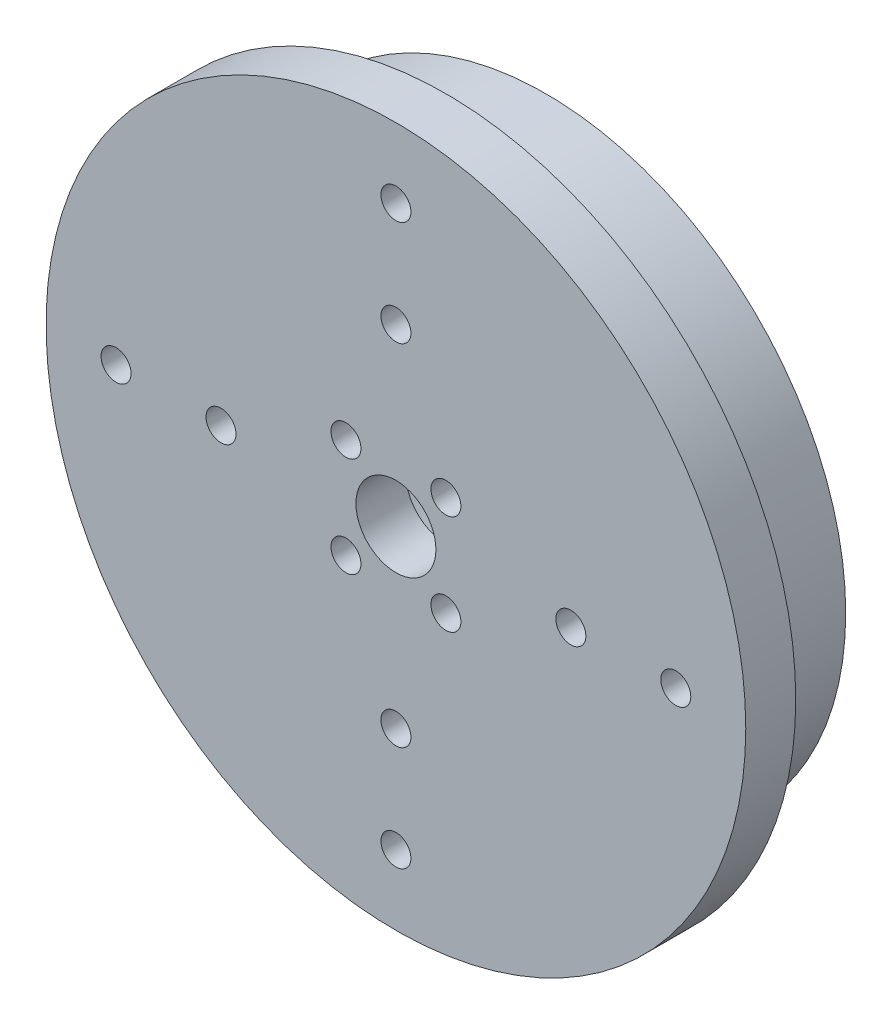
ISO-10303-21;
HEADER;
FILE_DESCRIPTION(('STEP AP214'),'2;1');
FILE_NAME('part.step','',(''),(''),'','','');
FILE_SCHEMA(('AUTOMOTIVE_DESIGN { 1 0 10303 214 1 1 1 1 }'));
ENDSEC;
DATA;
#1=APPLICATION_CONTEXT('core data for automotive mechanical design processes');
#2=APPLICATION_PROTOCOL_DEFINITION('international standard','automotive_design',2000,#1);
#3=PRODUCT_CONTEXT('',#1,'mechanical');
#4=PRODUCT('Part','Part','',(#3));
#5=PRODUCT_RELATED_PRODUCT_CATEGORY('part','',(#4));
#6=PRODUCT_DEFINITION_FORMATION('','',#4);
#7=PRODUCT_DEFINITION_CONTEXT('part definition',#1,'design');
#8=PRODUCT_DEFINITION('design','',#6,#7);
#9=PRODUCT_DEFINITION_SHAPE('','',#8);
#10=(LENGTH_UNIT() NAMED_UNIT(*) SI_UNIT(.MILLI.,.METRE.));
#11=(NAMED_UNIT(*) PLANE_ANGLE_UNIT() SI_UNIT($,.RADIAN.));
#12=(NAMED_UNIT(*) SI_UNIT($,.STERADIAN.) SOLID_ANGLE_UNIT());
#13=UNCERTAINTY_MEASURE_WITH_UNIT(LENGTH_MEASURE(1.E-05),#10,'distance_accuracy_value','');
#14=(GEOMETRIC_REPRESENTATION_CONTEXT(3) GLOBAL_UNCERTAINTY_ASSIGNED_CONTEXT((#13)) GLOBAL_UNIT_ASSIGNED_CONTEXT((#10,
#11,#12)) REPRESENTATION_CONTEXT('',''));
#15=CARTESIAN_POINT('',(0.,0.,0.));
#16=DIRECTION('',(0.,0.,1.));
#17=DIRECTION('',(1.,0.,0.));
#18=AXIS2_PLACEMENT_3D('',#15,#16,#17);
#19=CARTESIAN_POINT('',(0.,0.,0.));
#20=DIRECTION('',(0.,0.,1.));
#21=DIRECTION('',(1.,0.,0.));
#22=AXIS2_PLACEMENT_3D('',#19,#20,#21);
#23=PLANE('',#22);
#24=CARTESIAN_POINT('',(-4.99999999999998,-5.00000000000002,0.));
#25=DIRECTION('',(0.,0.,-1.));
#26=DIRECTION('',(-1.,0.,0.));
#27=AXIS2_PLACEMENT_3D('',#24,#25,#26);
#28=CIRCLE('',#27,1.5);
#29=CARTESIAN_POINT('',(-6.49999999999998,-5.00000000000002,0.));
#30=VERTEX_POINT('',#29);
#31=EDGE_CURVE('E231',#30,#30,#28,.T.);
#32=ORIENTED_EDGE('',*,*,#31,.F.);
#33=EDGE_LOOP('',(#32));
#34=FACE_BOUND('',#33,.T.);
#35=CARTESIAN_POINT('',(5.00000000000003,-4.99999999999997,0.));
#36=DIRECTION('',(0.,0.,-1.));
#37=DIRECTION('',(-1.,0.,0.));
#38=AXIS2_PLACEMENT_3D('',#35,#36,#37);
#39=CIRCLE('',#38,1.5);
#40=CARTESIAN_POINT('',(3.50000000000003,-4.99999999999997,0.));
#41=VERTEX_POINT('',#40);
#42=EDGE_CURVE('E232',#41,#41,#39,.T.);
#43=ORIENTED_EDGE('',*,*,#42,.F.);
#44=EDGE_LOOP('',(#43));
#45=FACE_BOUND('',#44,.T.);
#46=CARTESIAN_POINT('',(4.99999999999995,5.00000000000005,0.));
#47=DIRECTION('',(0.,0.,-1.));
#48=DIRECTION('',(-1.,0.,0.));
#49=AXIS2_PLACEMENT_3D('',#46,#47,#48);
#50=CIRCLE('',#49,1.5);
#51=CARTESIAN_POINT('',(3.49999999999995,5.00000000000005,0.));
#52=VERTEX_POINT('',#51);
#53=EDGE_CURVE('E243',#52,#52,#50,.T.);
#54=ORIENTED_EDGE('',*,*,#53,.F.);
#55=EDGE_LOOP('',(#54));
#56=FACE_BOUND('',#55,.T.);
#57=CARTESIAN_POINT('',(-5.,5.,0.));
#58=DIRECTION('',(0.,0.,-1.));
#59=DIRECTION('',(-1.,0.,0.));
#60=AXIS2_PLACEMENT_3D('',#57,#58,#59);
#61=CIRCLE('',#60,1.5);
#62=CARTESIAN_POINT('',(-6.5,5.,0.));
#63=VERTEX_POINT('',#62);
#64=EDGE_CURVE('E227',#63,#63,#61,.T.);
#65=ORIENTED_EDGE('',*,*,#64,.F.);
#66=EDGE_LOOP('',(#65));
#67=FACE_BOUND('',#66,.T.);
#68=CARTESIAN_POINT('',(0.,0.,0.));
#69=DIRECTION('',(0.,0.,-1.));
#70=DIRECTION('',(-1.,0.,0.));
#71=AXIS2_PLACEMENT_3D('',#68,#69,#70);
#72=CIRCLE('',#71,15.);
#73=CARTESIAN_POINT('',(-15.,0.,0.));
#74=VERTEX_POINT('',#73);
#75=EDGE_CURVE('E184',#74,#74,#72,.T.);
#76=ORIENTED_EDGE('',*,*,#75,.T.);
#77=EDGE_LOOP('',(#76));
#78=FACE_BOUND('',#77,.T.);
#79=CARTESIAN_POINT('',(0.,0.,0.));
#80=DIRECTION('',(0.,0.,-1.));
#81=DIRECTION('',(-1.,0.,0.));
#82=AXIS2_PLACEMENT_3D('',#79,#80,#81);
#83=CIRCLE('',#82,4.);
#84=CARTESIAN_POINT('',(-4.,0.,0.));
#85=VERTEX_POINT('',#84);
#86=EDGE_CURVE('E236',#85,#85,#83,.T.);
#87=ORIENTED_EDGE('',*,*,#86,.F.);
#88=EDGE_LOOP('',(#87));
#89=FACE_BOUND('',#88,.T.);
#90=ADVANCED_FACE('F99',(#34,#45,#56,#67,#78,#89),#23,.F.);
#91=CARTESIAN_POINT('',(0.,0.,0.));
#92=DIRECTION('',(0.,0.,1.));
#93=DIRECTION('',(1.,0.,0.));
#94=AXIS2_PLACEMENT_3D('',#91,#92,#93);
#95=CIRCLE('',#94,20.);
#96=CARTESIAN_POINT('',(20.,0.,0.));
#97=VERTEX_POINT('',#96);
#98=EDGE_CURVE('E11',#97,#97,#95,.F.);
#99=ORIENTED_EDGE('',*,*,#98,.F.);
#100=EDGE_LOOP('',(#99));
#101=FACE_BOUND('',#100,.T.);
#102=CARTESIAN_POINT('',(0.,0.,0.));
#103=DIRECTION('',(0.,0.,-1.));
#104=DIRECTION('',(-1.,0.,0.));
#105=AXIS2_PLACEMENT_3D('',#102,#103,#104);
#106=CIRCLE('',#105,26.);
#107=CARTESIAN_POINT('',(-26.,0.,0.));
#108=VERTEX_POINT('',#107);
#109=EDGE_CURVE('E156',#108,#108,#106,.T.);
#110=ORIENTED_EDGE('',*,*,#109,.T.);
#111=EDGE_LOOP('',(#110));
#112=FACE_BOUND('',#111,.T.);
#113=ADVANCED_FACE('F252',(#101,#112),#23,.F.);
#114=CARTESIAN_POINT('',(17.5,0.,5.));
#115=DIRECTION('',(0.,0.,-1.));
#116=DIRECTION('',(-1.,0.,0.));
#117=AXIS2_PLACEMENT_3D('',#114,#115,#116);
#118=CYLINDRICAL_SURFACE('',#117,1.5);
#119=CARTESIAN_POINT('',(17.5,0.,5.));
#120=DIRECTION('',(0.,0.,1.));
#121=DIRECTION('',(1.,0.,0.));
#122=AXIS2_PLACEMENT_3D('',#119,#120,#121);
#123=CIRCLE('',#122,1.5);
#124=CARTESIAN_POINT('',(19.,0.,5.));
#125=VERTEX_POINT('',#124);
#126=EDGE_CURVE('E125',#125,#125,#123,.T.);
#127=ORIENTED_EDGE('',*,*,#126,.T.);
#128=EDGE_LOOP('',(#127));
#129=FACE_BOUND('',#128,.T.);
#130=CARTESIAN_POINT('',(17.5,0.,-10.));
#131=DIRECTION('',(0.,0.,-1.));
#132=DIRECTION('',(-1.,0.,0.));
#133=AXIS2_PLACEMENT_3D('',#130,#131,#132);
#134=CIRCLE('',#133,1.5);
#135=CARTESIAN_POINT('',(16.,0.,-10.));
#136=VERTEX_POINT('',#135);
#137=EDGE_CURVE('E204',#136,#136,#134,.F.);
#138=ORIENTED_EDGE('',*,*,#137,.F.);
#139=EDGE_LOOP('',(#138));
#140=FACE_BOUND('',#139,.T.);
#141=ADVANCED_FACE('F317',(#129,#140),#118,.F.);
#142=CARTESIAN_POINT('',(-1.2220184685951E-13,-17.5,5.));
#143=DIRECTION('',(0.,0.,-1.));
#144=DIRECTION('',(-1.,0.,0.));
#145=AXIS2_PLACEMENT_3D('',#142,#143,#144);
#146=CYLINDRICAL_SURFACE('',#145,1.5);
#147=CARTESIAN_POINT('',(-1.2220184685951E-13,-17.5,5.));
#148=DIRECTION('',(0.,0.,1.));
#149=DIRECTION('',(1.,0.,0.));
#150=AXIS2_PLACEMENT_3D('',#147,#148,#149);
#151=CIRCLE('',#150,1.5);
#152=CARTESIAN_POINT('',(1.49999999999988,-17.5,5.));
#153=VERTEX_POINT('',#152);
#154=EDGE_CURVE('E129',#153,#153,#151,.T.);
#155=ORIENTED_EDGE('',*,*,#154,.T.);
#156=EDGE_LOOP('',(#155));
#157=FACE_BOUND('',#156,.T.);
#158=CARTESIAN_POINT('',(-1.2220184685951E-13,-17.5,-10.));
#159=DIRECTION('',(0.,0.,-1.));
#160=DIRECTION('',(-1.,0.,0.));
#161=AXIS2_PLACEMENT_3D('',#158,#159,#160);
#162=CIRCLE('',#161,1.5);
#163=CARTESIAN_POINT('',(-1.50000000000012,-17.5,-10.));
#164=VERTEX_POINT('',#163);
#165=EDGE_CURVE('E196',#164,#164,#162,.F.);
#166=ORIENTED_EDGE('',*,*,#165,.F.);
#167=EDGE_LOOP('',(#166));
#168=FACE_BOUND('',#167,.T.);
#169=ADVANCED_FACE('F320',(#157,#168),#146,.F.);
#170=CARTESIAN_POINT('',(-17.5,1.83302770289265E-13,5.));
#171=DIRECTION('',(0.,0.,-1.));
#172=DIRECTION('',(-1.,0.,0.));
#173=AXIS2_PLACEMENT_3D('',#170,#171,#172);
#174=CYLINDRICAL_SURFACE('',#173,1.5);
#175=CARTESIAN_POINT('',(-17.5,1.83302770289265E-13,5.));
#176=DIRECTION('',(0.,0.,1.));
#177=DIRECTION('',(1.,0.,0.));
#178=AXIS2_PLACEMENT_3D('',#175,#176,#177);
#179=CIRCLE('',#178,1.5);
#180=CARTESIAN_POINT('',(-16.,1.83302770289265E-13,5.));
#181=VERTEX_POINT('',#180);
#182=EDGE_CURVE('E133',#181,#181,#179,.T.);
#183=ORIENTED_EDGE('',*,*,#182,.T.);
#184=EDGE_LOOP('',(#183));
#185=FACE_BOUND('',#184,.T.);
#186=CARTESIAN_POINT('',(-17.5,1.83302770289265E-13,-10.));
#187=DIRECTION('',(0.,0.,-1.));
#188=DIRECTION('',(-1.,0.,0.));
#189=AXIS2_PLACEMENT_3D('',#186,#187,#188);
#190=CIRCLE('',#189,1.5);
#191=CARTESIAN_POINT('',(-19.,1.83302770289265E-13,-10.));
#192=VERTEX_POINT('',#191);
#193=EDGE_CURVE('E188',#192,#192,#190,.F.);
#194=ORIENTED_EDGE('',*,*,#193,.F.);
#195=EDGE_LOOP('',(#194));
#196=FACE_BOUND('',#195,.T.);
#197=ADVANCED_FACE('F324',(#185,#196),#174,.F.);
#198=CARTESIAN_POINT('',(0.,28.,5.));
#199=DIRECTION('',(0.,0.,-1.));
#200=DIRECTION('',(-1.,0.,0.));
#201=AXIS2_PLACEMENT_3D('',#198,#199,#200);
#202=CYLINDRICAL_SURFACE('',#201,1.5);
#203=CARTESIAN_POINT('',(0.,28.,5.));
#204=DIRECTION('',(0.,0.,1.));
#205=DIRECTION('',(1.,0.,0.));
#206=AXIS2_PLACEMENT_3D('',#203,#204,#205);
#207=CIRCLE('',#206,1.5);
#208=CARTESIAN_POINT('',(1.5,28.,5.));
#209=VERTEX_POINT('',#208);
#210=EDGE_CURVE('E137',#209,#209,#207,.T.);
#211=ORIENTED_EDGE('',*,*,#210,.T.);
#212=EDGE_LOOP('',(#211));
#213=FACE_BOUND('',#212,.T.);
#214=CARTESIAN_POINT('',(0.,28.,-10.));
#215=DIRECTION('',(0.,0.,-1.));
#216=DIRECTION('',(-1.,0.,0.));
#217=AXIS2_PLACEMENT_3D('',#214,#215,#216);
#218=CIRCLE('',#217,1.5);
#219=CARTESIAN_POINT('',(-1.5,28.,-10.));
#220=VERTEX_POINT('',#219);
#221=EDGE_CURVE('E177',#220,#220,#218,.F.);
#222=ORIENTED_EDGE('',*,*,#221,.F.);
#223=EDGE_LOOP('',(#222));
#224=FACE_BOUND('',#223,.T.);
#225=ADVANCED_FACE('F328',(#213,#224),#202,.F.);
#226=CARTESIAN_POINT('',(28.,0.,5.));
#227=DIRECTION('',(0.,0.,-1.));
#228=DIRECTION('',(-1.,0.,0.));
#229=AXIS2_PLACEMENT_3D('',#226,#227,#228);
#230=CYLINDRICAL_SURFACE('',#229,1.5);
#231=CARTESIAN_POINT('',(28.,0.,5.));
#232=DIRECTION('',(0.,0.,1.));
#233=DIRECTION('',(1.,0.,0.));
#234=AXIS2_PLACEMENT_3D('',#231,#232,#233);
#235=CIRCLE('',#234,1.5);
#236=CARTESIAN_POINT('',(29.5,0.,5.));
#237=VERTEX_POINT('',#236);
#238=EDGE_CURVE('E141',#237,#237,#235,.T.);
#239=ORIENTED_EDGE('',*,*,#238,.T.);
#240=EDGE_LOOP('',(#239));
#241=FACE_BOUND('',#240,.T.);
#242=CARTESIAN_POINT('',(28.,0.,-10.));
#243=DIRECTION('',(0.,0.,-1.));
#244=DIRECTION('',(-1.,0.,0.));
#245=AXIS2_PLACEMENT_3D('',#242,#243,#244);
#246=CIRCLE('',#245,1.5);
#247=CARTESIAN_POINT('',(26.5,0.,-10.));
#248=VERTEX_POINT('',#247);
#249=EDGE_CURVE('E173',#248,#248,#246,.F.);
#250=ORIENTED_EDGE('',*,*,#249,.F.);
#251=EDGE_LOOP('',(#250));
#252=FACE_BOUND('',#251,.T.);
#253=ADVANCED_FACE('F332',(#241,#252),#230,.F.);
#254=CARTESIAN_POINT('',(-1.95522954975215E-13,-28.,5.));
#255=DIRECTION('',(0.,0.,-1.));
#256=DIRECTION('',(-1.,0.,0.));
#257=AXIS2_PLACEMENT_3D('',#254,#255,#256);
#258=CYLINDRICAL_SURFACE('',#257,1.5);
#259=CARTESIAN_POINT('',(-1.95522954975215E-13,-28.,5.));
#260=DIRECTION('',(0.,0.,1.));
#261=DIRECTION('',(1.,0.,0.));
#262=AXIS2_PLACEMENT_3D('',#259,#260,#261);
#263=CIRCLE('',#262,1.5);
#264=CARTESIAN_POINT('',(1.4999999999998,-28.,5.));
#265=VERTEX_POINT('',#264);
#266=EDGE_CURVE('E145',#265,#265,#263,.T.);
#267=ORIENTED_EDGE('',*,*,#266,.T.);
#268=EDGE_LOOP('',(#267));
#269=FACE_BOUND('',#268,.T.);
#270=CARTESIAN_POINT('',(-1.95522954975215E-13,-28.,-10.));
#271=DIRECTION('',(0.,0.,-1.));
#272=DIRECTION('',(-1.,0.,0.));
#273=AXIS2_PLACEMENT_3D('',#270,#271,#272);
#274=CIRCLE('',#273,1.5);
#275=CARTESIAN_POINT('',(-1.5000000000002,-28.,-10.));
#276=VERTEX_POINT('',#275);
#277=EDGE_CURVE('E160',#276,#276,#274,.F.);
#278=ORIENTED_EDGE('',*,*,#277,.F.);
#279=EDGE_LOOP('',(#278));
#280=FACE_BOUND('',#279,.T.);
#281=ADVANCED_FACE('F336',(#269,#280),#258,.F.);
#282=CARTESIAN_POINT('',(-28.,2.93284432462823E-13,5.));
#283=DIRECTION('',(0.,0.,-1.));
#284=DIRECTION('',(-1.,0.,0.));
#285=AXIS2_PLACEMENT_3D('',#282,#283,#284);
#286=CYLINDRICAL_SURFACE('',#285,1.5);
#287=CARTESIAN_POINT('',(-28.,2.93284432462823E-13,5.));
#288=DIRECTION('',(0.,0.,1.));
#289=DIRECTION('',(1.,0.,0.));
#290=AXIS2_PLACEMENT_3D('',#287,#288,#289);
#291=CIRCLE('',#290,1.5);
#292=CARTESIAN_POINT('',(-26.5,2.93284432462823E-13,5.));
#293=VERTEX_POINT('',#292);
#294=EDGE_CURVE('E149',#293,#293,#291,.T.);
#295=ORIENTED_EDGE('',*,*,#294,.T.);
#296=EDGE_LOOP('',(#295));
#297=FACE_BOUND('',#296,.T.);
#298=CARTESIAN_POINT('',(-28.,2.93284432462823E-13,-10.));
#299=DIRECTION('',(0.,0.,-1.));
#300=DIRECTION('',(-1.,0.,0.));
#301=AXIS2_PLACEMENT_3D('',#298,#299,#300);
#302=CIRCLE('',#301,1.5);
#303=CARTESIAN_POINT('',(-29.5,2.93284432462823E-13,-10.));
#304=VERTEX_POINT('',#303);
#305=EDGE_CURVE('E169',#304,#304,#302,.F.);
#306=ORIENTED_EDGE('',*,*,#305,.F.);
#307=EDGE_LOOP('',(#306));
#308=FACE_BOUND('',#307,.T.);
#309=ADVANCED_FACE('F339',(#297,#308),#286,.F.);
#310=CARTESIAN_POINT('',(0.,0.,5.));
#311=DIRECTION('',(0.,0.,-1.));
#312=DIRECTION('',(-1.,0.,0.));
#313=AXIS2_PLACEMENT_3D('',#310,#311,#312);
#314=CYLINDRICAL_SURFACE('',#313,35.);
#315=CARTESIAN_POINT('',(0.,0.,5.));
#316=DIRECTION('',(0.,0.,1.));
#317=DIRECTION('',(1.,0.,0.));
#318=AXIS2_PLACEMENT_3D('',#315,#316,#317);
#319=CIRCLE('',#318,35.);
#320=CARTESIAN_POINT('',(35.,0.,5.));
#321=VERTEX_POINT('',#320);
#322=EDGE_CURVE('E120',#321,#321,#319,.T.);
#323=ORIENTED_EDGE('',*,*,#322,.F.);
#324=EDGE_LOOP('',(#323));
#325=FACE_BOUND('',#324,.T.);
#326=CARTESIAN_POINT('',(0.,0.,0.));
#327=DIRECTION('',(0.,0.,1.));
#328=DIRECTION('',(1.,0.,0.));
#329=AXIS2_PLACEMENT_3D('',#326,#327,#328);
#330=CIRCLE('',#329,35.);
#331=CARTESIAN_POINT('',(35.,0.,0.));
#332=VERTEX_POINT('',#331);
#333=EDGE_CURVE('E116',#332,#332,#330,.T.);
#334=ORIENTED_EDGE('',*,*,#333,.T.);
#335=EDGE_LOOP('',(#334));
#336=FACE_BOUND('',#335,.T.);
#337=ADVANCED_FACE('F101',(#325,#336),#314,.T.);
#338=CARTESIAN_POINT('',(0.,17.5,5.));
#339=DIRECTION('',(0.,0.,-1.));
#340=DIRECTION('',(-1.,0.,0.));
#341=AXIS2_PLACEMENT_3D('',#338,#339,#340);
#342=CYLINDRICAL_SURFACE('',#341,1.5);
#343=CARTESIAN_POINT('',(0.,17.5,5.));
#344=DIRECTION('',(0.,0.,1.));
#345=DIRECTION('',(1.,0.,0.));
#346=AXIS2_PLACEMENT_3D('',#343,#344,#345);
#347=CIRCLE('',#346,1.5);
#348=CARTESIAN_POINT('',(1.5,17.5,5.));
#349=VERTEX_POINT('',#348);
#350=EDGE_CURVE('E113',#349,#349,#347,.T.);
#351=ORIENTED_EDGE('',*,*,#350,.T.);
#352=EDGE_LOOP('',(#351));
#353=FACE_BOUND('',#352,.T.);
#354=CARTESIAN_POINT('',(0.,17.5,-10.));
#355=DIRECTION('',(0.,0.,-1.));
#356=DIRECTION('',(-1.,0.,0.));
#357=AXIS2_PLACEMENT_3D('',#354,#355,#356);
#358=CIRCLE('',#357,1.5);
#359=CARTESIAN_POINT('',(-1.5,17.5,-10.));
#360=VERTEX_POINT('',#359);
#361=EDGE_CURVE('E200',#360,#360,#358,.F.);
#362=ORIENTED_EDGE('',*,*,#361,.F.);
#363=EDGE_LOOP('',(#362));
#364=FACE_BOUND('',#363,.T.);
#365=ADVANCED_FACE('F309',(#353,#364),#342,.F.);
#366=CARTESIAN_POINT('',(0.,0.,5.));
#367=DIRECTION('',(0.,0.,1.));
#368=DIRECTION('',(1.,0.,0.));
#369=AXIS2_PLACEMENT_3D('',#366,#367,#368);
#370=PLANE('',#369);
#371=CARTESIAN_POINT('',(-4.99999999999998,-5.00000000000002,5.));
#372=DIRECTION('',(0.,0.,1.));
#373=DIRECTION('',(1.,0.,0.));
#374=AXIS2_PLACEMENT_3D('',#371,#372,#373);
#375=CIRCLE('',#374,1.5);
#376=CARTESIAN_POINT('',(-3.49999999999998,-5.00000000000002,5.));
#377=VERTEX_POINT('',#376);
#378=EDGE_CURVE('E211',#377,#377,#375,.T.);
#379=ORIENTED_EDGE('',*,*,#378,.F.);
#380=EDGE_LOOP('',(#379));
#381=FACE_BOUND('',#380,.T.);
#382=CARTESIAN_POINT('',(5.00000000000003,-4.99999999999997,5.));
#383=DIRECTION('',(0.,0.,1.));
#384=DIRECTION('',(1.,0.,0.));
#385=AXIS2_PLACEMENT_3D('',#382,#383,#384);
#386=CIRCLE('',#385,1.5);
#387=CARTESIAN_POINT('',(6.50000000000003,-4.99999999999997,5.));
#388=VERTEX_POINT('',#387);
#389=EDGE_CURVE('E215',#388,#388,#386,.T.);
#390=ORIENTED_EDGE('',*,*,#389,.F.);
#391=EDGE_LOOP('',(#390));
#392=FACE_BOUND('',#391,.T.);
#393=CARTESIAN_POINT('',(4.99999999999995,5.00000000000005,5.));
#394=DIRECTION('',(0.,0.,1.));
#395=DIRECTION('',(1.,0.,0.));
#396=AXIS2_PLACEMENT_3D('',#393,#394,#395);
#397=CIRCLE('',#396,1.5);
#398=CARTESIAN_POINT('',(6.49999999999995,5.00000000000005,5.));
#399=VERTEX_POINT('',#398);
#400=EDGE_CURVE('E219',#399,#399,#397,.T.);
#401=ORIENTED_EDGE('',*,*,#400,.F.);
#402=EDGE_LOOP('',(#401));
#403=FACE_BOUND('',#402,.T.);
#404=CARTESIAN_POINT('',(0.,0.,5.));
#405=DIRECTION('',(0.,0.,1.));
#406=DIRECTION('',(1.,0.,0.));
#407=AXIS2_PLACEMENT_3D('',#404,#405,#406);
#408=CIRCLE('',#407,4.);
#409=CARTESIAN_POINT('',(4.,0.,5.));
#410=VERTEX_POINT('',#409);
#411=EDGE_CURVE('E103',#410,#410,#408,.T.);
#412=ORIENTED_EDGE('',*,*,#411,.F.);
#413=EDGE_LOOP('',(#412));
#414=FACE_BOUND('',#413,.T.);
#415=CARTESIAN_POINT('',(-5.,5.,5.));
#416=DIRECTION('',(0.,0.,1.));
#417=DIRECTION('',(1.,0.,0.));
#418=AXIS2_PLACEMENT_3D('',#415,#416,#417);
#419=CIRCLE('',#418,1.5);
#420=CARTESIAN_POINT('',(-3.5,5.,5.));
#421=VERTEX_POINT('',#420);
#422=EDGE_CURVE('E223',#421,#421,#419,.T.);
#423=ORIENTED_EDGE('',*,*,#422,.F.);
#424=EDGE_LOOP('',(#423));
#425=FACE_BOUND('',#424,.T.);
#426=ORIENTED_EDGE('',*,*,#322,.T.);
#427=EDGE_LOOP('',(#426));
#428=FACE_BOUND('',#427,.T.);
#429=ORIENTED_EDGE('',*,*,#294,.F.);
#430=EDGE_LOOP('',(#429));
#431=FACE_BOUND('',#430,.T.);
#432=ORIENTED_EDGE('',*,*,#266,.F.);
#433=EDGE_LOOP('',(#432));
#434=FACE_BOUND('',#433,.T.);
#435=ORIENTED_EDGE('',*,*,#238,.F.);
#436=EDGE_LOOP('',(#435));
#437=FACE_BOUND('',#436,.T.);
#438=ORIENTED_EDGE('',*,*,#210,.F.);
#439=EDGE_LOOP('',(#438));
#440=FACE_BOUND('',#439,.T.);
#441=ORIENTED_EDGE('',*,*,#182,.F.);
#442=EDGE_LOOP('',(#441));
#443=FACE_BOUND('',#442,.T.);
#444=ORIENTED_EDGE('',*,*,#154,.F.);
#445=EDGE_LOOP('',(#444));
#446=FACE_BOUND('',#445,.T.);
#447=ORIENTED_EDGE('',*,*,#126,.F.);
#448=EDGE_LOOP('',(#447));
#449=FACE_BOUND('',#448,.T.);
#450=ORIENTED_EDGE('',*,*,#350,.F.);
#451=EDGE_LOOP('',(#450));
#452=FACE_BOUND('',#451,.T.);
#453=ADVANCED_FACE('F307',(#381,#392,#403,#414,#425,#428,#431,#434,#437,#440,#443,#446,#449,
#452),#370,.T.);
#454=CARTESIAN_POINT('',(0.,0.,0.));
#455=DIRECTION('',(0.,0.,1.));
#456=DIRECTION('',(1.,0.,0.));
#457=AXIS2_PLACEMENT_3D('',#454,#455,#456);
#458=CIRCLE('',#457,30.);
#459=CARTESIAN_POINT('',(30.,0.,0.));
#460=VERTEX_POINT('',#459);
#461=EDGE_CURVE('E108',#460,#460,#458,.F.);
#462=ORIENTED_EDGE('',*,*,#461,.F.);
#463=EDGE_LOOP('',(#462));
#464=FACE_BOUND('',#463,.T.);
#465=ORIENTED_EDGE('',*,*,#333,.F.);
#466=EDGE_LOOP('',(#465));
#467=FACE_BOUND('',#466,.T.);
#468=ADVANCED_FACE('F255',(#464,#467),#23,.F.);
#469=CARTESIAN_POINT('',(0.,0.,-10.));
#470=DIRECTION('',(0.,0.,1.));
#471=DIRECTION('',(1.,0.,0.));
#472=AXIS2_PLACEMENT_3D('',#469,#470,#471);
#473=CYLINDRICAL_SURFACE('',#472,26.);
#474=CARTESIAN_POINT('',(0.,0.,-10.));
#475=DIRECTION('',(0.,0.,-1.));
#476=DIRECTION('',(-1.,0.,0.));
#477=AXIS2_PLACEMENT_3D('',#474,#475,#476);
#478=CIRCLE('',#477,26.);
#479=CARTESIAN_POINT('',(-26.,0.,-10.));
#480=VERTEX_POINT('',#479);
#481=EDGE_CURVE('E165',#480,#480,#478,.T.);
#482=ORIENTED_EDGE('',*,*,#481,.T.);
#483=EDGE_LOOP('',(#482));
#484=FACE_BOUND('',#483,.T.);
#485=ORIENTED_EDGE('',*,*,#109,.F.);
#486=EDGE_LOOP('',(#485));
#487=FACE_BOUND('',#486,.T.);
#488=ADVANCED_FACE('F302',(#484,#487),#473,.F.);
#489=CARTESIAN_POINT('',(0.,0.,-10.));
#490=DIRECTION('',(0.,0.,1.));
#491=DIRECTION('',(1.,0.,0.));
#492=AXIS2_PLACEMENT_3D('',#489,#490,#491);
#493=CYLINDRICAL_SURFACE('',#492,30.);
#494=CARTESIAN_POINT('',(0.,0.,-10.));
#495=DIRECTION('',(0.,0.,-1.));
#496=DIRECTION('',(-1.,0.,0.));
#497=AXIS2_PLACEMENT_3D('',#494,#495,#496);
#498=CIRCLE('',#497,30.);
#499=CARTESIAN_POINT('',(-30.,0.,-10.));
#500=VERTEX_POINT('',#499);
#501=EDGE_CURVE('E121',#500,#500,#498,.T.);
#502=ORIENTED_EDGE('',*,*,#501,.F.);
#503=EDGE_LOOP('',(#502));
#504=FACE_BOUND('',#503,.T.);
#505=ORIENTED_EDGE('',*,*,#461,.T.);
#506=EDGE_LOOP('',(#505));
#507=FACE_BOUND('',#506,.T.);
#508=ADVANCED_FACE('F298',(#504,#507),#493,.T.);
#509=CARTESIAN_POINT('',(0.,0.,-10.));
#510=DIRECTION('',(0.,0.,-1.));
#511=DIRECTION('',(-1.,0.,0.));
#512=AXIS2_PLACEMENT_3D('',#509,#510,#511);
#513=PLANE('',#512);
#514=ORIENTED_EDGE('',*,*,#277,.T.);
#515=EDGE_LOOP('',(#514));
#516=FACE_BOUND('',#515,.T.);
#517=ORIENTED_EDGE('',*,*,#221,.T.);
#518=EDGE_LOOP('',(#517));
#519=FACE_BOUND('',#518,.T.);
#520=ORIENTED_EDGE('',*,*,#249,.T.);
#521=EDGE_LOOP('',(#520));
#522=FACE_BOUND('',#521,.T.);
#523=ORIENTED_EDGE('',*,*,#305,.T.);
#524=EDGE_LOOP('',(#523));
#525=FACE_BOUND('',#524,.T.);
#526=ORIENTED_EDGE('',*,*,#481,.F.);
#527=EDGE_LOOP('',(#526));
#528=FACE_BOUND('',#527,.T.);
#529=ORIENTED_EDGE('',*,*,#501,.T.);
#530=EDGE_LOOP('',(#529));
#531=FACE_BOUND('',#530,.T.);
#532=ADVANCED_FACE('F294',(#516,#519,#522,#525,#528,#531),#513,.T.);
#533=CARTESIAN_POINT('',(0.,0.,-10.));
#534=DIRECTION('',(0.,0.,1.));
#535=DIRECTION('',(1.,0.,0.));
#536=AXIS2_PLACEMENT_3D('',#533,#534,#535);
#537=CYLINDRICAL_SURFACE('',#536,15.);
#538=CARTESIAN_POINT('',(0.,0.,-10.));
#539=DIRECTION('',(0.,0.,-1.));
#540=DIRECTION('',(-1.,0.,0.));
#541=AXIS2_PLACEMENT_3D('',#538,#539,#540);
#542=CIRCLE('',#541,15.);
#543=CARTESIAN_POINT('',(-15.,0.,-10.));
#544=VERTEX_POINT('',#543);
#545=EDGE_CURVE('E192',#544,#544,#542,.T.);
#546=ORIENTED_EDGE('',*,*,#545,.T.);
#547=EDGE_LOOP('',(#546));
#548=FACE_BOUND('',#547,.T.);
#549=ORIENTED_EDGE('',*,*,#75,.F.);
#550=EDGE_LOOP('',(#549));
#551=FACE_BOUND('',#550,.T.);
#552=ADVANCED_FACE('F290',(#548,#551),#537,.F.);
#553=CARTESIAN_POINT('',(0.,0.,-10.));
#554=DIRECTION('',(0.,0.,1.));
#555=DIRECTION('',(1.,0.,0.));
#556=AXIS2_PLACEMENT_3D('',#553,#554,#555);
#557=CYLINDRICAL_SURFACE('',#556,20.);
#558=CARTESIAN_POINT('',(0.,0.,-10.));
#559=DIRECTION('',(0.,0.,-1.));
#560=DIRECTION('',(-1.,0.,0.));
#561=AXIS2_PLACEMENT_3D('',#558,#559,#560);
#562=CIRCLE('',#561,20.);
#563=CARTESIAN_POINT('',(-20.,0.,-10.));
#564=VERTEX_POINT('',#563);
#565=EDGE_CURVE('E161',#564,#564,#562,.T.);
#566=ORIENTED_EDGE('',*,*,#565,.F.);
#567=EDGE_LOOP('',(#566));
#568=FACE_BOUND('',#567,.T.);
#569=ORIENTED_EDGE('',*,*,#98,.T.);
#570=EDGE_LOOP('',(#569));
#571=FACE_BOUND('',#570,.T.);
#572=ADVANCED_FACE('F286',(#568,#571),#557,.T.);
#573=CARTESIAN_POINT('',(0.,0.,-10.));
#574=DIRECTION('',(0.,0.,-1.));
#575=DIRECTION('',(-1.,0.,0.));
#576=AXIS2_PLACEMENT_3D('',#573,#574,#575);
#577=PLANE('',#576);
#578=ORIENTED_EDGE('',*,*,#193,.T.);
#579=EDGE_LOOP('',(#578));
#580=FACE_BOUND('',#579,.T.);
#581=ORIENTED_EDGE('',*,*,#137,.T.);
#582=EDGE_LOOP('',(#581));
#583=FACE_BOUND('',#582,.T.);
#584=ORIENTED_EDGE('',*,*,#361,.T.);
#585=EDGE_LOOP('',(#584));
#586=FACE_BOUND('',#585,.T.);
#587=ORIENTED_EDGE('',*,*,#165,.T.);
#588=EDGE_LOOP('',(#587));
#589=FACE_BOUND('',#588,.T.);
#590=ORIENTED_EDGE('',*,*,#545,.F.);
#591=EDGE_LOOP('',(#590));
#592=FACE_BOUND('',#591,.T.);
#593=ORIENTED_EDGE('',*,*,#565,.T.);
#594=EDGE_LOOP('',(#593));
#595=FACE_BOUND('',#594,.T.);
#596=ADVANCED_FACE('F282',(#580,#583,#586,#589,#592,#595),#577,.T.);
#597=CARTESIAN_POINT('',(-5.,5.,10.));
#598=DIRECTION('',(0.,0.,-1.));
#599=DIRECTION('',(-1.,0.,0.));
#600=AXIS2_PLACEMENT_3D('',#597,#598,#599);
#601=CYLINDRICAL_SURFACE('',#600,1.5);
#602=ORIENTED_EDGE('',*,*,#422,.T.);
#603=EDGE_LOOP('',(#602));
#604=FACE_BOUND('',#603,.T.);
#605=ORIENTED_EDGE('',*,*,#64,.T.);
#606=EDGE_LOOP('',(#605));
#607=FACE_BOUND('',#606,.T.);
#608=ADVANCED_FACE('F279',(#604,#607),#601,.F.);
#609=CARTESIAN_POINT('',(4.99999999999995,5.00000000000005,10.));
#610=DIRECTION('',(0.,0.,-1.));
#611=DIRECTION('',(-1.,0.,0.));
#612=AXIS2_PLACEMENT_3D('',#609,#610,#611);
#613=CYLINDRICAL_SURFACE('',#612,1.5);
#614=ORIENTED_EDGE('',*,*,#400,.T.);
#615=EDGE_LOOP('',(#614));
#616=FACE_BOUND('',#615,.T.);
#617=ORIENTED_EDGE('',*,*,#53,.T.);
#618=EDGE_LOOP('',(#617));
#619=FACE_BOUND('',#618,.T.);
#620=ADVANCED_FACE('F248',(#616,#619),#613,.F.);
#621=CARTESIAN_POINT('',(5.00000000000003,-4.99999999999997,10.));
#622=DIRECTION('',(0.,0.,-1.));
#623=DIRECTION('',(-1.,0.,0.));
#624=AXIS2_PLACEMENT_3D('',#621,#622,#623);
#625=CYLINDRICAL_SURFACE('',#624,1.5);
#626=ORIENTED_EDGE('',*,*,#389,.T.);
#627=EDGE_LOOP('',(#626));
#628=FACE_BOUND('',#627,.T.);
#629=ORIENTED_EDGE('',*,*,#42,.T.);
#630=EDGE_LOOP('',(#629));
#631=FACE_BOUND('',#630,.T.);
#632=ADVANCED_FACE('F270',(#628,#631),#625,.F.);
#633=CARTESIAN_POINT('',(-4.99999999999998,-5.00000000000002,10.));
#634=DIRECTION('',(0.,0.,-1.));
#635=DIRECTION('',(-1.,0.,0.));
#636=AXIS2_PLACEMENT_3D('',#633,#634,#635);
#637=CYLINDRICAL_SURFACE('',#636,1.5);
#638=ORIENTED_EDGE('',*,*,#378,.T.);
#639=EDGE_LOOP('',(#638));
#640=FACE_BOUND('',#639,.T.);
#641=ORIENTED_EDGE('',*,*,#31,.T.);
#642=EDGE_LOOP('',(#641));
#643=FACE_BOUND('',#642,.T.);
#644=ADVANCED_FACE('F264',(#640,#643),#637,.F.);
#645=CARTESIAN_POINT('',(0.,0.,10.));
#646=DIRECTION('',(0.,0.,-1.));
#647=DIRECTION('',(-1.,0.,0.));
#648=AXIS2_PLACEMENT_3D('',#645,#646,#647);
#649=CYLINDRICAL_SURFACE('',#648,4.);
#650=ORIENTED_EDGE('',*,*,#411,.T.);
#651=EDGE_LOOP('',(#650));
#652=FACE_BOUND('',#651,.T.);
#653=ORIENTED_EDGE('',*,*,#86,.T.);
#654=EDGE_LOOP('',(#653));
#655=FACE_BOUND('',#654,.T.);
#656=ADVANCED_FACE('F262',(#652,#655),#649,.F.);
#657=CLOSED_SHELL('',(#90,#113,#141,#169,#197,#225,#253,#281,#309,#337,#365,#453,#468,#488,#508,
#532,#552,#572,#596,#608,#620,#632,#644,#656));
#658=MANIFOLD_SOLID_BREP('B2',#657);
#659=ADVANCED_BREP_SHAPE_REPRESENTATION('',(#18,#658),#14);
#660=SHAPE_DEFINITION_REPRESENTATION(#9,#659);
ENDSEC;
END-ISO-10303-21;
